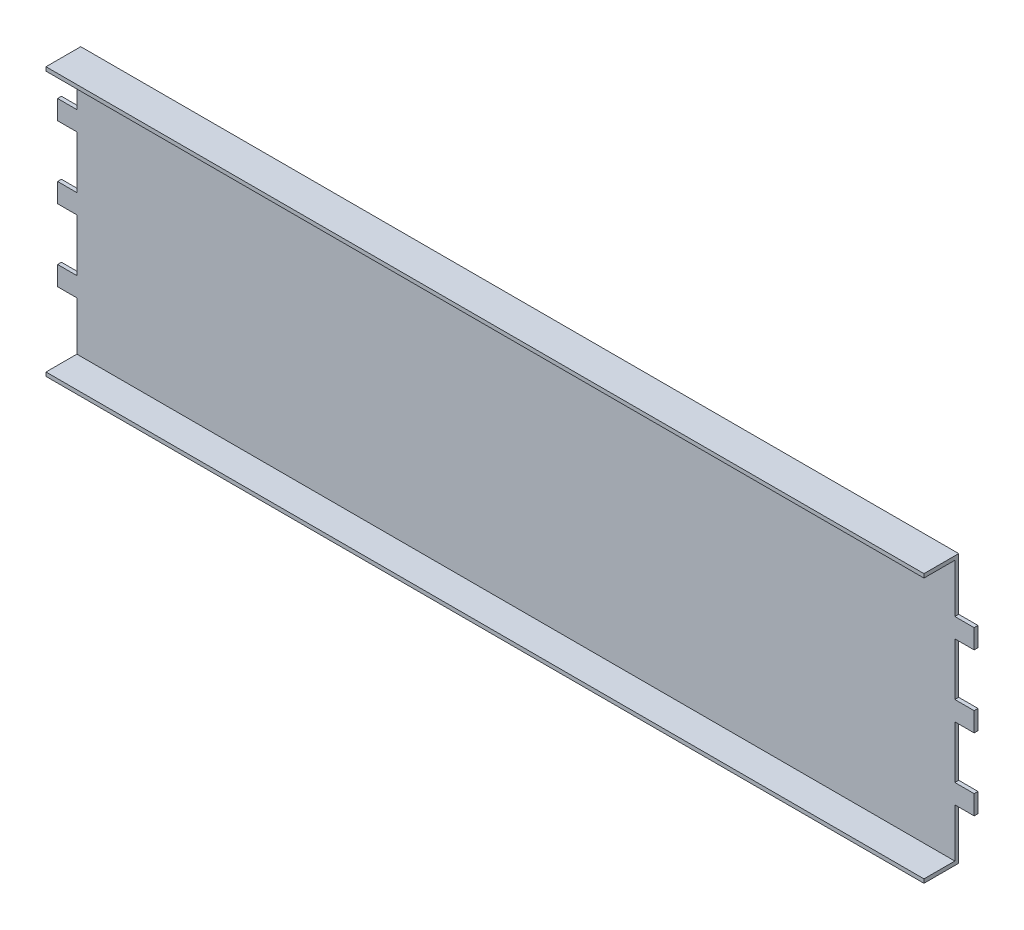
ISO-10303-21;
HEADER;
FILE_DESCRIPTION(('STEP AP214'),'2;1');
FILE_NAME('part.step','',(''),(''),'','','');
FILE_SCHEMA(('AUTOMOTIVE_DESIGN { 1 0 10303 214 1 1 1 1 }'));
ENDSEC;
DATA;
#1=APPLICATION_CONTEXT('core data for automotive mechanical design processes');
#2=APPLICATION_PROTOCOL_DEFINITION('international standard','automotive_design',2000,#1);
#3=PRODUCT_CONTEXT('',#1,'mechanical');
#4=PRODUCT('Part','Part','',(#3));
#5=PRODUCT_RELATED_PRODUCT_CATEGORY('part','',(#4));
#6=PRODUCT_DEFINITION_FORMATION('','',#4);
#7=PRODUCT_DEFINITION_CONTEXT('part definition',#1,'design');
#8=PRODUCT_DEFINITION('design','',#6,#7);
#9=PRODUCT_DEFINITION_SHAPE('','',#8);
#10=(LENGTH_UNIT() NAMED_UNIT(*) SI_UNIT(.MILLI.,.METRE.));
#11=(NAMED_UNIT(*) PLANE_ANGLE_UNIT() SI_UNIT($,.RADIAN.));
#12=(NAMED_UNIT(*) SI_UNIT($,.STERADIAN.) SOLID_ANGLE_UNIT());
#13=UNCERTAINTY_MEASURE_WITH_UNIT(LENGTH_MEASURE(1.E-05),#10,'distance_accuracy_value','');
#14=(GEOMETRIC_REPRESENTATION_CONTEXT(3) GLOBAL_UNCERTAINTY_ASSIGNED_CONTEXT((#13)) GLOBAL_UNIT_ASSIGNED_CONTEXT((#10,
#11,#12)) REPRESENTATION_CONTEXT('',''));
#15=CARTESIAN_POINT('',(0.,0.,0.));
#16=DIRECTION('',(0.,0.,1.));
#17=DIRECTION('',(1.,0.,0.));
#18=AXIS2_PLACEMENT_3D('',#15,#16,#17);
#19=CARTESIAN_POINT('',(90.5,81.5000000000001,0.));
#20=DIRECTION('',(1.,0.,0.));
#21=DIRECTION('',(0.,1.,0.));
#22=AXIS2_PLACEMENT_3D('',#19,#20,#21);
#23=PLANE('',#22);
#24=DIRECTION('',(0.,-1.,0.));
#25=VECTOR('',#24,1.);
#26=CARTESIAN_POINT('',(90.4999999999999,-1.02295014862437E-13,-8.00000000000001));
#27=LINE('',#26,#25);
#28=CARTESIAN_POINT('',(90.5000000000009,914.375000000002,-8.00000000000001));
#29=VERTEX_POINT('',#28);
#30=CARTESIAN_POINT('',(90.5000000000009,900.750000000002,-7.99999999999981));
#31=VERTEX_POINT('',#30);
#32=EDGE_CURVE('E344',#29,#31,#27,.T.);
#33=ORIENTED_EDGE('',*,*,#32,.F.);
#34=DIRECTION('',(0.,0.,-1.));
#35=VECTOR('',#34,1.);
#36=CARTESIAN_POINT('',(90.5000000000009,914.375000000002,-7.99999999999981));
#37=LINE('',#36,#35);
#38=CARTESIAN_POINT('',(90.5000000000009,914.375000000002,-9.00000000000001));
#39=VERTEX_POINT('',#38);
#40=EDGE_CURVE('E408',#29,#39,#37,.T.);
#41=ORIENTED_EDGE('',*,*,#40,.T.);
#42=DIRECTION('',(0.,-1.,0.));
#43=VECTOR('',#42,1.);
#44=CARTESIAN_POINT('',(90.4999999999999,-1.02295014862437E-13,-9.00000000000001));
#45=LINE('',#44,#43);
#46=CARTESIAN_POINT('',(90.5000000000009,900.750000000002,-9.00000000000001));
#47=VERTEX_POINT('',#46);
#48=EDGE_CURVE('E232',#39,#47,#45,.T.);
#49=ORIENTED_EDGE('',*,*,#48,.T.);
#50=DIRECTION('',(0.,0.,-1.));
#51=VECTOR('',#50,1.);
#52=CARTESIAN_POINT('',(90.5000000000009,900.750000000002,-7.99999999999981));
#53=LINE('',#52,#51);
#54=EDGE_CURVE('E379',#31,#47,#53,.T.);
#55=ORIENTED_EDGE('',*,*,#54,.F.);
#56=EDGE_LOOP('',(#33,#41,#49,#55));
#57=FACE_BOUND('',#56,.T.);
#58=ADVANCED_FACE('F15',(#57),#23,.F.);
#59=CARTESIAN_POINT('',(90.5000000000009,895.750000000002,-8.00000000000001));
#60=VERTEX_POINT('',#59);
#61=CARTESIAN_POINT('',(90.5000000000009,882.125000000002,-7.99999999999981));
#62=VERTEX_POINT('',#61);
#63=EDGE_CURVE('E844',#60,#62,#27,.T.);
#64=ORIENTED_EDGE('',*,*,#63,.F.);
#65=DIRECTION('',(0.,0.,-1.));
#66=VECTOR('',#65,1.);
#67=CARTESIAN_POINT('',(90.5000000000009,895.750000000002,-7.99999999999981));
#68=LINE('',#67,#66);
#69=CARTESIAN_POINT('',(90.5000000000009,895.750000000002,-9.00000000000001));
#70=VERTEX_POINT('',#69);
#71=EDGE_CURVE('E376',#60,#70,#68,.T.);
#72=ORIENTED_EDGE('',*,*,#71,.T.);
#73=CARTESIAN_POINT('',(90.5000000000009,882.125000000002,-9.00000000000001));
#74=VERTEX_POINT('',#73);
#75=EDGE_CURVE('E854',#70,#74,#45,.T.);
#76=ORIENTED_EDGE('',*,*,#75,.T.);
#77=DIRECTION('',(0.,0.,-1.));
#78=VECTOR('',#77,1.);
#79=CARTESIAN_POINT('',(90.5000000000009,882.125000000002,-7.99999999999981));
#80=LINE('',#79,#78);
#81=EDGE_CURVE('E318',#62,#74,#80,.T.);
#82=ORIENTED_EDGE('',*,*,#81,.F.);
#83=EDGE_LOOP('',(#64,#72,#76,#82));
#84=FACE_BOUND('',#83,.T.);
#85=ADVANCED_FACE('F564',(#84),#23,.F.);
#86=CARTESIAN_POINT('',(90.5000000000009,933.000000000002,-8.99999999999988));
#87=VERTEX_POINT('',#86);
#88=CARTESIAN_POINT('',(90.5000000000009,919.375000000002,-9.00000000000001));
#89=VERTEX_POINT('',#88);
#90=EDGE_CURVE('E229',#87,#89,#45,.T.);
#91=ORIENTED_EDGE('',*,*,#90,.T.);
#92=DIRECTION('',(0.,0.,-1.));
#93=VECTOR('',#92,1.);
#94=CARTESIAN_POINT('',(90.5000000000009,919.375000000002,-7.99999999999981));
#95=LINE('',#94,#93);
#96=CARTESIAN_POINT('',(90.5000000000009,919.375000000002,-7.99999999999981));
#97=VERTEX_POINT('',#96);
#98=EDGE_CURVE('E423',#97,#89,#95,.T.);
#99=ORIENTED_EDGE('',*,*,#98,.F.);
#100=CARTESIAN_POINT('',(90.5000000000009,932.000000000002,-7.99999999999981));
#101=VERTEX_POINT('',#100);
#102=EDGE_CURVE('E290',#101,#97,#27,.T.);
#103=ORIENTED_EDGE('',*,*,#102,.F.);
#104=DIRECTION('',(0.,0.,1.));
#105=VECTOR('',#104,1.);
#106=CARTESIAN_POINT('',(90.5000000000009,932.000000000002,-9.00000000000001));
#107=LINE('',#106,#105);
#108=CARTESIAN_POINT('',(90.5000000000009,932.000000000002,0.));
#109=VERTEX_POINT('',#108);
#110=EDGE_CURVE('E233',#101,#109,#107,.T.);
#111=ORIENTED_EDGE('',*,*,#110,.T.);
#112=DIRECTION('',(0.,-1.,0.));
#113=VECTOR('',#112,1.);
#114=CARTESIAN_POINT('',(90.5000000000009,863.500000000002,2.18575157973073E-13));
#115=LINE('',#114,#113);
#116=CARTESIAN_POINT('',(90.5000000000009,933.,0.));
#117=VERTEX_POINT('',#116);
#118=EDGE_CURVE('E185',#117,#109,#115,.T.);
#119=ORIENTED_EDGE('',*,*,#118,.F.);
#120=DIRECTION('',(0.,0.,1.));
#121=VECTOR('',#120,1.);
#122=CARTESIAN_POINT('',(90.5000000000009,933.000000000002,-9.00000000000001));
#123=LINE('',#122,#121);
#124=EDGE_CURVE('E193',#87,#117,#123,.T.);
#125=ORIENTED_EDGE('',*,*,#124,.F.);
#126=EDGE_LOOP('',(#91,#99,#103,#111,#119,#125));
#127=FACE_BOUND('',#126,.T.);
#128=ADVANCED_FACE('F509',(#127),#23,.F.);
#129=CARTESIAN_POINT('',(318.000000000002,863.500000000001,2.18575157973071E-13));
#130=DIRECTION('',(-1.,0.,0.));
#131=DIRECTION('',(0.,-1.,0.));
#132=AXIS2_PLACEMENT_3D('',#129,#130,#131);
#133=PLANE('',#132);
#134=DIRECTION('',(0.,1.,0.));
#135=VECTOR('',#134,1.);
#136=CARTESIAN_POINT('',(318.000000000003,4.17332834956603E-13,-8.00000000000001));
#137=LINE('',#136,#135);
#138=CARTESIAN_POINT('',(318.000000000001,882.125000000002,-8.00000000000001));
#139=VERTEX_POINT('',#138);
#140=CARTESIAN_POINT('',(318.000000000001,895.750000000002,-7.99999999999981));
#141=VERTEX_POINT('',#140);
#142=EDGE_CURVE('E194',#139,#141,#137,.T.);
#143=ORIENTED_EDGE('',*,*,#142,.F.);
#144=DIRECTION('',(0.,0.,-1.));
#145=VECTOR('',#144,1.);
#146=CARTESIAN_POINT('',(318.000000000001,882.125000000002,-7.99999999999981));
#147=LINE('',#146,#145);
#148=CARTESIAN_POINT('',(318.000000000001,882.125000000002,-9.00000000000001));
#149=VERTEX_POINT('',#148);
#150=EDGE_CURVE('E162',#139,#149,#147,.T.);
#151=ORIENTED_EDGE('',*,*,#150,.T.);
#152=DIRECTION('',(0.,1.,0.));
#153=VECTOR('',#152,1.);
#154=CARTESIAN_POINT('',(318.000000000003,4.17332834956603E-13,-9.00000000000001));
#155=LINE('',#154,#153);
#156=CARTESIAN_POINT('',(318.000000000001,895.750000000002,-9.00000000000001));
#157=VERTEX_POINT('',#156);
#158=EDGE_CURVE('E178',#149,#157,#155,.T.);
#159=ORIENTED_EDGE('',*,*,#158,.T.);
#160=DIRECTION('',(0.,0.,-1.));
#161=VECTOR('',#160,1.);
#162=CARTESIAN_POINT('',(318.000000000001,895.750000000002,-7.99999999999981));
#163=LINE('',#162,#161);
#164=EDGE_CURVE('E244',#141,#157,#163,.T.);
#165=ORIENTED_EDGE('',*,*,#164,.F.);
#166=EDGE_LOOP('',(#143,#151,#159,#165));
#167=FACE_BOUND('',#166,.T.);
#168=ADVANCED_FACE('F556',(#167),#133,.F.);
#169=DIRECTION('',(0.,1.,0.));
#170=VECTOR('',#169,1.);
#171=CARTESIAN_POINT('',(318.000000000003,4.17332834956603E-13,-8.00000000000001));
#172=LINE('',#171,#170);
#173=CARTESIAN_POINT('',(318.000000000001,900.750000000002,-8.00000000000001));
#174=VERTEX_POINT('',#173);
#175=CARTESIAN_POINT('',(318.000000000001,914.375000000002,-7.99999999999981));
#176=VERTEX_POINT('',#175);
#177=EDGE_CURVE('E268',#174,#176,#172,.T.);
#178=ORIENTED_EDGE('',*,*,#177,.F.);
#179=DIRECTION('',(0.,0.,-1.));
#180=VECTOR('',#179,1.);
#181=CARTESIAN_POINT('',(318.000000000001,900.750000000002,-7.99999999999981));
#182=LINE('',#181,#180);
#183=CARTESIAN_POINT('',(318.000000000001,900.750000000002,-9.00000000000001));
#184=VERTEX_POINT('',#183);
#185=EDGE_CURVE('E247',#174,#184,#182,.T.);
#186=ORIENTED_EDGE('',*,*,#185,.T.);
#187=DIRECTION('',(0.,1.,0.));
#188=VECTOR('',#187,1.);
#189=CARTESIAN_POINT('',(318.000000000003,4.17332834956603E-13,-9.00000000000001));
#190=LINE('',#189,#188);
#191=CARTESIAN_POINT('',(318.000000000001,914.375000000002,-9.00000000000001));
#192=VERTEX_POINT('',#191);
#193=EDGE_CURVE('E299',#184,#192,#190,.T.);
#194=ORIENTED_EDGE('',*,*,#193,.T.);
#195=DIRECTION('',(0.,0.,-1.));
#196=VECTOR('',#195,1.);
#197=CARTESIAN_POINT('',(318.000000000001,914.375000000002,-7.99999999999981));
#198=LINE('',#197,#196);
#199=EDGE_CURVE('E256',#176,#192,#198,.T.);
#200=ORIENTED_EDGE('',*,*,#199,.F.);
#201=EDGE_LOOP('',(#178,#186,#194,#200));
#202=FACE_BOUND('',#201,.T.);
#203=ADVANCED_FACE('F542',(#202),#133,.F.);
#204=DIRECTION('',(0.,1.,0.));
#205=VECTOR('',#204,1.);
#206=CARTESIAN_POINT('',(318.000000000003,4.17332834956603E-13,-9.00000000000001));
#207=LINE('',#206,#205);
#208=CARTESIAN_POINT('',(318.000000000001,863.500000000002,-8.99999999999985));
#209=VERTEX_POINT('',#208);
#210=CARTESIAN_POINT('',(318.000000000001,877.125000000002,-9.00000000000001));
#211=VERTEX_POINT('',#210);
#212=EDGE_CURVE('E175',#209,#211,#207,.T.);
#213=ORIENTED_EDGE('',*,*,#212,.T.);
#214=DIRECTION('',(0.,0.,-1.));
#215=VECTOR('',#214,1.);
#216=CARTESIAN_POINT('',(318.000000000001,877.125000000002,-7.99999999999981));
#217=LINE('',#216,#215);
#218=CARTESIAN_POINT('',(318.000000000001,877.125000000002,-7.99999999999981));
#219=VERTEX_POINT('',#218);
#220=EDGE_CURVE('E198',#219,#211,#217,.T.);
#221=ORIENTED_EDGE('',*,*,#220,.F.);
#222=DIRECTION('',(0.,1.,0.));
#223=VECTOR('',#222,1.);
#224=CARTESIAN_POINT('',(318.000000000003,4.17332834956603E-13,-8.00000000000001));
#225=LINE('',#224,#223);
#226=CARTESIAN_POINT('',(318.000000000002,864.5,-7.9999999999999));
#227=VERTEX_POINT('',#226);
#228=EDGE_CURVE('E191',#227,#219,#225,.T.);
#229=ORIENTED_EDGE('',*,*,#228,.F.);
#230=DIRECTION('',(0.,0.,-1.));
#231=VECTOR('',#230,1.);
#232=CARTESIAN_POINT('',(318.000000000002,864.5,-840.081223467358));
#233=LINE('',#232,#231);
#234=CARTESIAN_POINT('',(318.000000000002,864.5,0.));
#235=VERTEX_POINT('',#234);
#236=EDGE_CURVE('E187',#235,#227,#233,.T.);
#237=ORIENTED_EDGE('',*,*,#236,.F.);
#238=DIRECTION('',(0.,1.,0.));
#239=VECTOR('',#238,1.);
#240=CARTESIAN_POINT('',(318.000000000002,863.500000000001,2.18575157973071E-13));
#241=LINE('',#240,#239);
#242=CARTESIAN_POINT('',(318.000000000002,863.500000000001,2.18575157973071E-13));
#243=VERTEX_POINT('',#242);
#244=EDGE_CURVE('E183',#243,#235,#241,.T.);
#245=ORIENTED_EDGE('',*,*,#244,.F.);
#246=DIRECTION('',(0.,0.,1.));
#247=VECTOR('',#246,1.);
#248=CARTESIAN_POINT('',(318.000000000001,863.500000000002,-7.99999999999959));
#249=LINE('',#248,#247);
#250=EDGE_CURVE('E179',#209,#243,#249,.T.);
#251=ORIENTED_EDGE('',*,*,#250,.F.);
#252=EDGE_LOOP('',(#213,#221,#229,#237,#245,#251));
#253=FACE_BOUND('',#252,.T.);
#254=ADVANCED_FACE('F201',(#253),#133,.F.);
#255=CARTESIAN_POINT('',(90.5000000000009,877.125000000002,-7.99999999999981));
#256=VERTEX_POINT('',#255);
#257=CARTESIAN_POINT('',(90.5000000000009,864.500000000001,-7.9999999999999));
#258=VERTEX_POINT('',#257);
#259=EDGE_CURVE('E209',#256,#258,#27,.T.);
#260=ORIENTED_EDGE('',*,*,#259,.F.);
#261=DIRECTION('',(0.,0.,-1.));
#262=VECTOR('',#261,1.);
#263=CARTESIAN_POINT('',(90.5000000000009,877.125000000002,-7.99999999999981));
#264=LINE('',#263,#262);
#265=CARTESIAN_POINT('',(90.5000000000009,877.125000000002,-9.00000000000001));
#266=VERTEX_POINT('',#265);
#267=EDGE_CURVE('E315',#256,#266,#264,.T.);
#268=ORIENTED_EDGE('',*,*,#267,.T.);
#269=CARTESIAN_POINT('',(90.5000000000009,863.500000000002,-8.9999999999997));
#270=VERTEX_POINT('',#269);
#271=EDGE_CURVE('E177',#266,#270,#45,.T.);
#272=ORIENTED_EDGE('',*,*,#271,.T.);
#273=DIRECTION('',(0.,0.,1.));
#274=VECTOR('',#273,1.);
#275=CARTESIAN_POINT('',(90.5000000000014,863.500000000002,-7.99999999999962));
#276=LINE('',#275,#274);
#277=CARTESIAN_POINT('',(90.5,863.500000000002,0.));
#278=VERTEX_POINT('',#277);
#279=EDGE_CURVE('E238',#270,#278,#276,.T.);
#280=ORIENTED_EDGE('',*,*,#279,.T.);
#281=DIRECTION('',(0.,-1.,0.));
#282=VECTOR('',#281,1.);
#283=CARTESIAN_POINT('',(90.5000000000009,863.500000000002,2.18575157973073E-13));
#284=LINE('',#283,#282);
#285=CARTESIAN_POINT('',(90.5000000000009,864.5,0.));
#286=VERTEX_POINT('',#285);
#287=EDGE_CURVE('E186',#286,#278,#284,.T.);
#288=ORIENTED_EDGE('',*,*,#287,.F.);
#289=DIRECTION('',(0.,0.,1.));
#290=VECTOR('',#289,1.);
#291=CARTESIAN_POINT('',(90.5000000000009,864.500000000001,-840.081223467358));
#292=LINE('',#291,#290);
#293=EDGE_CURVE('E190',#258,#286,#292,.T.);
#294=ORIENTED_EDGE('',*,*,#293,.F.);
#295=EDGE_LOOP('',(#260,#268,#272,#280,#288,#294));
#296=FACE_BOUND('',#295,.T.);
#297=ADVANCED_FACE('F355',(#296),#23,.F.);
#298=DIRECTION('',(0.,1.,0.));
#299=VECTOR('',#298,1.);
#300=CARTESIAN_POINT('',(318.000000000003,4.17332834956603E-13,-8.00000000000001));
#301=LINE('',#300,#299);
#302=CARTESIAN_POINT('',(318.000000000001,919.375000000002,-7.99999999999981));
#303=VERTEX_POINT('',#302);
#304=CARTESIAN_POINT('',(318.000000000001,932.000000000002,-7.99999999999981));
#305=VERTEX_POINT('',#304);
#306=EDGE_CURVE('E279',#303,#305,#301,.T.);
#307=ORIENTED_EDGE('',*,*,#306,.F.);
#308=DIRECTION('',(0.,0.,-1.));
#309=VECTOR('',#308,1.);
#310=CARTESIAN_POINT('',(318.000000000001,919.375000000002,-7.99999999999981));
#311=LINE('',#310,#309);
#312=CARTESIAN_POINT('',(318.000000000001,919.375000000002,-9.00000000000001));
#313=VERTEX_POINT('',#312);
#314=EDGE_CURVE('E241',#303,#313,#311,.T.);
#315=ORIENTED_EDGE('',*,*,#314,.T.);
#316=DIRECTION('',(0.,1.,0.));
#317=VECTOR('',#316,1.);
#318=CARTESIAN_POINT('',(318.000000000003,4.17332834956603E-13,-9.00000000000001));
#319=LINE('',#318,#317);
#320=CARTESIAN_POINT('',(318.000000000001,933.000000000002,-8.99999999999988));
#321=VERTEX_POINT('',#320);
#322=EDGE_CURVE('E236',#313,#321,#319,.T.);
#323=ORIENTED_EDGE('',*,*,#322,.T.);
#324=DIRECTION('',(0.,0.,-1.));
#325=VECTOR('',#324,1.);
#326=CARTESIAN_POINT('',(318.000000000001,933.000000000002,-9.00000000000001));
#327=LINE('',#326,#325);
#328=CARTESIAN_POINT('',(318.000000000001,933.,0.));
#329=VERTEX_POINT('',#328);
#330=EDGE_CURVE('E295',#329,#321,#327,.T.);
#331=ORIENTED_EDGE('',*,*,#330,.F.);
#332=DIRECTION('',(0.,1.,0.));
#333=VECTOR('',#332,1.);
#334=CARTESIAN_POINT('',(318.000000000002,863.500000000001,2.18575157973071E-13));
#335=LINE('',#334,#333);
#336=CARTESIAN_POINT('',(318.000000000001,932.000000000002,0.));
#337=VERTEX_POINT('',#336);
#338=EDGE_CURVE('E293',#337,#329,#335,.T.);
#339=ORIENTED_EDGE('',*,*,#338,.F.);
#340=DIRECTION('',(0.,0.,-1.));
#341=VECTOR('',#340,1.);
#342=CARTESIAN_POINT('',(318.000000000001,932.000000000002,-9.00000000000001));
#343=LINE('',#342,#341);
#344=EDGE_CURVE('E237',#337,#305,#343,.T.);
#345=ORIENTED_EDGE('',*,*,#344,.T.);
#346=EDGE_LOOP('',(#307,#315,#323,#331,#339,#345));
#347=FACE_BOUND('',#346,.T.);
#348=ADVANCED_FACE('F518',(#347),#133,.F.);
#349=CARTESIAN_POINT('',(358.000000000002,863.500000000001,2.18575157973071E-13));
#350=DIRECTION('',(0.,0.,-1.));
#351=DIRECTION('',(0.,1.,0.));
#352=AXIS2_PLACEMENT_3D('',#349,#350,#351);
#353=PLANE('',#352);
#354=DIRECTION('',(1.,0.,0.));
#355=VECTOR('',#354,1.);
#356=CARTESIAN_POINT('',(0.,933.,0.));
#357=LINE('',#356,#355);
#358=EDGE_CURVE('E223',#329,#117,#357,.F.);
#359=ORIENTED_EDGE('',*,*,#358,.T.);
#360=ORIENTED_EDGE('',*,*,#118,.T.);
#361=DIRECTION('',(1.,0.,0.));
#362=VECTOR('',#361,1.);
#363=CARTESIAN_POINT('',(0.,932.000000000002,0.));
#364=LINE('',#363,#362);
#365=EDGE_CURVE('E220',#109,#337,#364,.T.);
#366=ORIENTED_EDGE('',*,*,#365,.T.);
#367=ORIENTED_EDGE('',*,*,#338,.T.);
#368=EDGE_LOOP('',(#359,#360,#366,#367));
#369=FACE_BOUND('',#368,.T.);
#370=ADVANCED_FACE('F513',(#369),#353,.F.);
#371=CARTESIAN_POINT('',(0.,0.,-9.00000000000001));
#372=DIRECTION('',(0.,0.,-1.));
#373=DIRECTION('',(0.,1.,0.));
#374=AXIS2_PLACEMENT_3D('',#371,#372,#373);
#375=PLANE('',#374);
#376=ORIENTED_EDGE('',*,*,#90,.F.);
#377=DIRECTION('',(1.,0.,0.));
#378=VECTOR('',#377,1.);
#379=CARTESIAN_POINT('',(437.500000000002,933.000000000002,-8.99999999999988));
#380=LINE('',#379,#378);
#381=EDGE_CURVE('E10',#87,#321,#380,.T.);
#382=ORIENTED_EDGE('',*,*,#381,.T.);
#383=ORIENTED_EDGE('',*,*,#322,.F.);
#384=DIRECTION('',(1.,0.,0.));
#385=VECTOR('',#384,1.);
#386=CARTESIAN_POINT('',(318.000000000001,919.375000000002,-9.00000000000001));
#387=LINE('',#386,#385);
#388=CARTESIAN_POINT('',(323.000000000001,919.375000000002,-9.00000000000001));
#389=VERTEX_POINT('',#388);
#390=EDGE_CURVE('E255',#313,#389,#387,.T.);
#391=ORIENTED_EDGE('',*,*,#390,.T.);
#392=DIRECTION('',(0.,-1.,0.));
#393=VECTOR('',#392,1.);
#394=CARTESIAN_POINT('',(323.000000000001,919.375000000002,-9.00000000000001));
#395=LINE('',#394,#393);
#396=CARTESIAN_POINT('',(323.000000000001,914.375000000002,-9.00000000000001));
#397=VERTEX_POINT('',#396);
#398=EDGE_CURVE('E302',#389,#397,#395,.T.);
#399=ORIENTED_EDGE('',*,*,#398,.T.);
#400=DIRECTION('',(-1.,0.,0.));
#401=VECTOR('',#400,1.);
#402=CARTESIAN_POINT('',(318.000000000001,914.375000000002,-9.00000000000001));
#403=LINE('',#402,#401);
#404=EDGE_CURVE('E288',#397,#192,#403,.T.);
#405=ORIENTED_EDGE('',*,*,#404,.T.);
#406=ORIENTED_EDGE('',*,*,#193,.F.);
#407=DIRECTION('',(1.,0.,0.));
#408=VECTOR('',#407,1.);
#409=CARTESIAN_POINT('',(318.000000000001,900.750000000002,-9.00000000000001));
#410=LINE('',#409,#408);
#411=CARTESIAN_POINT('',(323.000000000001,900.750000000002,-9.00000000000001));
#412=VERTEX_POINT('',#411);
#413=EDGE_CURVE('E243',#184,#412,#410,.T.);
#414=ORIENTED_EDGE('',*,*,#413,.T.);
#415=DIRECTION('',(0.,-1.,0.));
#416=VECTOR('',#415,1.);
#417=CARTESIAN_POINT('',(323.000000000001,900.750000000002,-9.00000000000001));
#418=LINE('',#417,#416);
#419=CARTESIAN_POINT('',(323.000000000001,895.750000000002,-9.00000000000001));
#420=VERTEX_POINT('',#419);
#421=EDGE_CURVE('E310',#412,#420,#418,.T.);
#422=ORIENTED_EDGE('',*,*,#421,.T.);
#423=DIRECTION('',(-1.,0.,0.));
#424=VECTOR('',#423,1.);
#425=CARTESIAN_POINT('',(318.000000000001,895.750000000002,-9.00000000000001));
#426=LINE('',#425,#424);
#427=EDGE_CURVE('E277',#420,#157,#426,.T.);
#428=ORIENTED_EDGE('',*,*,#427,.T.);
#429=ORIENTED_EDGE('',*,*,#158,.F.);
#430=DIRECTION('',(1.,0.,0.));
#431=VECTOR('',#430,1.);
#432=CARTESIAN_POINT('',(318.000000000001,882.125000000002,-9.00000000000001));
#433=LINE('',#432,#431);
#434=CARTESIAN_POINT('',(323.000000000001,882.125000000002,-9.00000000000001));
#435=VERTEX_POINT('',#434);
#436=EDGE_CURVE('E171',#149,#435,#433,.T.);
#437=ORIENTED_EDGE('',*,*,#436,.T.);
#438=DIRECTION('',(0.,-1.,0.));
#439=VECTOR('',#438,1.);
#440=CARTESIAN_POINT('',(323.000000000001,882.125000000002,-9.00000000000001));
#441=LINE('',#440,#439);
#442=CARTESIAN_POINT('',(323.000000000001,877.125000000002,-9.00000000000001));
#443=VERTEX_POINT('',#442);
#444=EDGE_CURVE('E147',#435,#443,#441,.T.);
#445=ORIENTED_EDGE('',*,*,#444,.T.);
#446=DIRECTION('',(-1.,0.,0.));
#447=VECTOR('',#446,1.);
#448=CARTESIAN_POINT('',(318.000000000001,877.125000000002,-9.00000000000001));
#449=LINE('',#448,#447);
#450=EDGE_CURVE('E164',#443,#211,#449,.T.);
#451=ORIENTED_EDGE('',*,*,#450,.T.);
#452=ORIENTED_EDGE('',*,*,#212,.F.);
#453=DIRECTION('',(-1.,0.,0.));
#454=VECTOR('',#453,1.);
#455=CARTESIAN_POINT('',(90.0000000000015,863.500000000002,-8.9999999999997));
#456=LINE('',#455,#454);
#457=EDGE_CURVE('E25',#209,#270,#456,.T.);
#458=ORIENTED_EDGE('',*,*,#457,.T.);
#459=ORIENTED_EDGE('',*,*,#271,.F.);
#460=DIRECTION('',(-1.,0.,0.));
#461=VECTOR('',#460,1.);
#462=CARTESIAN_POINT('',(90.5000000000009,877.125000000002,-9.00000000000001));
#463=LINE('',#462,#461);
#464=CARTESIAN_POINT('',(85.5000000000009,877.125000000002,-9.00000000000001));
#465=VERTEX_POINT('',#464);
#466=EDGE_CURVE('E368',#266,#465,#463,.T.);
#467=ORIENTED_EDGE('',*,*,#466,.T.);
#468=DIRECTION('',(0.,1.,0.));
#469=VECTOR('',#468,1.);
#470=CARTESIAN_POINT('',(85.5000000000009,877.125000000002,-9.00000000000001));
#471=LINE('',#470,#469);
#472=CARTESIAN_POINT('',(85.5000000000009,882.125000000002,-9.00000000000001));
#473=VERTEX_POINT('',#472);
#474=EDGE_CURVE('E375',#465,#473,#471,.T.);
#475=ORIENTED_EDGE('',*,*,#474,.T.);
#476=DIRECTION('',(1.,0.,0.));
#477=VECTOR('',#476,1.);
#478=CARTESIAN_POINT('',(90.5000000000009,882.125000000002,-9.00000000000001));
#479=LINE('',#478,#477);
#480=EDGE_CURVE('E328',#473,#74,#479,.T.);
#481=ORIENTED_EDGE('',*,*,#480,.T.);
#482=ORIENTED_EDGE('',*,*,#75,.F.);
#483=DIRECTION('',(-1.,0.,0.));
#484=VECTOR('',#483,1.);
#485=CARTESIAN_POINT('',(90.5000000000009,895.750000000002,-9.00000000000001));
#486=LINE('',#485,#484);
#487=CARTESIAN_POINT('',(85.5000000000009,895.750000000002,-9.00000000000001));
#488=VERTEX_POINT('',#487);
#489=EDGE_CURVE('E405',#70,#488,#486,.T.);
#490=ORIENTED_EDGE('',*,*,#489,.T.);
#491=DIRECTION('',(0.,1.,0.));
#492=VECTOR('',#491,1.);
#493=CARTESIAN_POINT('',(85.5000000000009,895.750000000002,-9.00000000000001));
#494=LINE('',#493,#492);
#495=CARTESIAN_POINT('',(85.5000000000009,900.750000000002,-9.00000000000001));
#496=VERTEX_POINT('',#495);
#497=EDGE_CURVE('E402',#488,#496,#494,.T.);
#498=ORIENTED_EDGE('',*,*,#497,.T.);
#499=DIRECTION('',(1.,0.,0.));
#500=VECTOR('',#499,1.);
#501=CARTESIAN_POINT('',(90.5000000000009,900.750000000002,-9.00000000000001));
#502=LINE('',#501,#500);
#503=EDGE_CURVE('E398',#496,#47,#502,.T.);
#504=ORIENTED_EDGE('',*,*,#503,.T.);
#505=ORIENTED_EDGE('',*,*,#48,.F.);
#506=DIRECTION('',(-1.,0.,0.));
#507=VECTOR('',#506,1.);
#508=CARTESIAN_POINT('',(90.5000000000009,914.375000000002,-9.00000000000001));
#509=LINE('',#508,#507);
#510=CARTESIAN_POINT('',(85.5000000000009,914.375000000002,-9.00000000000001));
#511=VERTEX_POINT('',#510);
#512=EDGE_CURVE('E434',#39,#511,#509,.T.);
#513=ORIENTED_EDGE('',*,*,#512,.T.);
#514=DIRECTION('',(0.,1.,0.));
#515=VECTOR('',#514,1.);
#516=CARTESIAN_POINT('',(85.5000000000009,914.375000000002,-9.00000000000001));
#517=LINE('',#516,#515);
#518=CARTESIAN_POINT('',(85.5000000000009,919.375000000002,-9.00000000000001));
#519=VERTEX_POINT('',#518);
#520=EDGE_CURVE('E431',#511,#519,#517,.T.);
#521=ORIENTED_EDGE('',*,*,#520,.T.);
#522=DIRECTION('',(1.,0.,0.));
#523=VECTOR('',#522,1.);
#524=CARTESIAN_POINT('',(90.5000000000009,919.375000000002,-9.00000000000001));
#525=LINE('',#524,#523);
#526=EDGE_CURVE('E428',#519,#89,#525,.T.);
#527=ORIENTED_EDGE('',*,*,#526,.T.);
#528=EDGE_LOOP('',(#376,#382,#383,#391,#399,#405,#406,#414,#422,#428,#429,#437,#445,#451,#452,
#458,#459,#467,#475,#481,#482,#490,#498,#504,#505,#513,#521,#527));
#529=FACE_BOUND('',#528,.T.);
#530=ADVANCED_FACE('F520',(#529),#375,.T.);
#531=CARTESIAN_POINT('',(437.500000000002,933.000000000002,-9.00000000000001));
#532=DIRECTION('',(0.,-1.,0.));
#533=DIRECTION('',(1.,0.,0.));
#534=AXIS2_PLACEMENT_3D('',#531,#532,#533);
#535=PLANE('',#534);
#536=ORIENTED_EDGE('',*,*,#381,.F.);
#537=ORIENTED_EDGE('',*,*,#124,.T.);
#538=ORIENTED_EDGE('',*,*,#358,.F.);
#539=ORIENTED_EDGE('',*,*,#330,.T.);
#540=EDGE_LOOP('',(#536,#537,#538,#539));
#541=FACE_BOUND('',#540,.T.);
#542=ADVANCED_FACE('F506',(#541),#535,.F.);
#543=DIRECTION('',(1.,0.,0.));
#544=VECTOR('',#543,1.);
#545=CARTESIAN_POINT('',(0.,864.5,0.));
#546=LINE('',#545,#544);
#547=EDGE_CURVE('E226',#235,#286,#546,.F.);
#548=ORIENTED_EDGE('',*,*,#547,.T.);
#549=ORIENTED_EDGE('',*,*,#287,.T.);
#550=DIRECTION('',(1.,0.,0.));
#551=VECTOR('',#550,1.);
#552=CARTESIAN_POINT('',(0.,863.500000000001,0.));
#553=LINE('',#552,#551);
#554=EDGE_CURVE('E189',#278,#243,#553,.T.);
#555=ORIENTED_EDGE('',*,*,#554,.T.);
#556=ORIENTED_EDGE('',*,*,#244,.T.);
#557=EDGE_LOOP('',(#548,#549,#555,#556));
#558=FACE_BOUND('',#557,.T.);
#559=ADVANCED_FACE('F350',(#558),#353,.F.);
#560=CARTESIAN_POINT('',(0.,0.,-8.00000000000001));
#561=DIRECTION('',(0.,0.,-1.));
#562=DIRECTION('',(0.,1.,0.));
#563=AXIS2_PLACEMENT_3D('',#560,#561,#562);
#564=PLANE('',#563);
#565=DIRECTION('',(1.,0.,0.));
#566=VECTOR('',#565,1.);
#567=CARTESIAN_POINT('',(437.500000000002,932.000000000002,-7.99999999999981));
#568=LINE('',#567,#566);
#569=EDGE_CURVE('E182',#101,#305,#568,.T.);
#570=ORIENTED_EDGE('',*,*,#569,.F.);
#571=ORIENTED_EDGE('',*,*,#102,.T.);
#572=DIRECTION('',(1.,0.,0.));
#573=VECTOR('',#572,1.);
#574=CARTESIAN_POINT('',(90.5000000000009,919.375000000002,-7.99999999999981));
#575=LINE('',#574,#573);
#576=CARTESIAN_POINT('',(85.5000000000009,919.375000000002,-7.99999999999981));
#577=VERTEX_POINT('',#576);
#578=EDGE_CURVE('E420',#577,#97,#575,.T.);
#579=ORIENTED_EDGE('',*,*,#578,.F.);
#580=DIRECTION('',(0.,1.,0.));
#581=VECTOR('',#580,1.);
#582=CARTESIAN_POINT('',(85.5000000000009,914.375000000002,-7.99999999999981));
#583=LINE('',#582,#581);
#584=CARTESIAN_POINT('',(85.5000000000009,914.375000000002,-7.99999999999981));
#585=VERTEX_POINT('',#584);
#586=EDGE_CURVE('E439',#585,#577,#583,.T.);
#587=ORIENTED_EDGE('',*,*,#586,.F.);
#588=DIRECTION('',(-1.,0.,0.));
#589=VECTOR('',#588,1.);
#590=CARTESIAN_POINT('',(90.5000000000009,914.375000000002,-7.99999999999981));
#591=LINE('',#590,#589);
#592=EDGE_CURVE('E34',#29,#585,#591,.T.);
#593=ORIENTED_EDGE('',*,*,#592,.F.);
#594=ORIENTED_EDGE('',*,*,#32,.T.);
#595=DIRECTION('',(1.,0.,0.));
#596=VECTOR('',#595,1.);
#597=CARTESIAN_POINT('',(90.5000000000009,900.750000000002,-7.99999999999981));
#598=LINE('',#597,#596);
#599=CARTESIAN_POINT('',(85.5000000000009,900.750000000002,-7.99999999999981));
#600=VERTEX_POINT('',#599);
#601=EDGE_CURVE('E393',#600,#31,#598,.T.);
#602=ORIENTED_EDGE('',*,*,#601,.F.);
#603=DIRECTION('',(0.,1.,0.));
#604=VECTOR('',#603,1.);
#605=CARTESIAN_POINT('',(85.5000000000009,895.750000000002,-7.99999999999981));
#606=LINE('',#605,#604);
#607=CARTESIAN_POINT('',(85.5000000000009,895.750000000002,-7.99999999999981));
#608=VERTEX_POINT('',#607);
#609=EDGE_CURVE('E411',#608,#600,#606,.T.);
#610=ORIENTED_EDGE('',*,*,#609,.F.);
#611=DIRECTION('',(-1.,0.,0.));
#612=VECTOR('',#611,1.);
#613=CARTESIAN_POINT('',(90.5000000000009,895.750000000002,-7.99999999999981));
#614=LINE('',#613,#612);
#615=EDGE_CURVE('E401',#60,#608,#614,.T.);
#616=ORIENTED_EDGE('',*,*,#615,.F.);
#617=ORIENTED_EDGE('',*,*,#63,.T.);
#618=DIRECTION('',(1.,0.,0.));
#619=VECTOR('',#618,1.);
#620=CARTESIAN_POINT('',(90.5000000000009,882.125000000002,-7.99999999999981));
#621=LINE('',#620,#619);
#622=CARTESIAN_POINT('',(85.5000000000009,882.125000000002,-7.99999999999981));
#623=VERTEX_POINT('',#622);
#624=EDGE_CURVE('E336',#623,#62,#621,.T.);
#625=ORIENTED_EDGE('',*,*,#624,.F.);
#626=DIRECTION('',(0.,1.,0.));
#627=VECTOR('',#626,1.);
#628=CARTESIAN_POINT('',(85.5000000000009,877.125000000002,-7.99999999999981));
#629=LINE('',#628,#627);
#630=CARTESIAN_POINT('',(85.5000000000009,877.125000000002,-7.99999999999981));
#631=VERTEX_POINT('',#630);
#632=EDGE_CURVE('E384',#631,#623,#629,.T.);
#633=ORIENTED_EDGE('',*,*,#632,.F.);
#634=DIRECTION('',(-1.,0.,0.));
#635=VECTOR('',#634,1.);
#636=CARTESIAN_POINT('',(90.5000000000009,877.125000000002,-7.99999999999981));
#637=LINE('',#636,#635);
#638=EDGE_CURVE('E387',#256,#631,#637,.T.);
#639=ORIENTED_EDGE('',*,*,#638,.F.);
#640=ORIENTED_EDGE('',*,*,#259,.T.);
#641=DIRECTION('',(1.,0.,0.));
#642=VECTOR('',#641,1.);
#643=CARTESIAN_POINT('',(358.000000000002,864.5,-7.9999999999999));
#644=LINE('',#643,#642);
#645=EDGE_CURVE('E181',#258,#227,#644,.T.);
#646=ORIENTED_EDGE('',*,*,#645,.T.);
#647=ORIENTED_EDGE('',*,*,#228,.T.);
#648=DIRECTION('',(-1.,0.,0.));
#649=VECTOR('',#648,1.);
#650=CARTESIAN_POINT('',(318.000000000001,877.125000000002,-7.99999999999981));
#651=LINE('',#650,#649);
#652=CARTESIAN_POINT('',(323.000000000001,877.125000000002,-7.99999999999981));
#653=VERTEX_POINT('',#652);
#654=EDGE_CURVE('E152',#653,#219,#651,.T.);
#655=ORIENTED_EDGE('',*,*,#654,.F.);
#656=DIRECTION('',(0.,-1.,0.));
#657=VECTOR('',#656,1.);
#658=CARTESIAN_POINT('',(323.000000000001,882.125000000002,-7.99999999999981));
#659=LINE('',#658,#657);
#660=CARTESIAN_POINT('',(323.000000000001,882.125000000002,-7.99999999999981));
#661=VERTEX_POINT('',#660);
#662=EDGE_CURVE('E145',#661,#653,#659,.T.);
#663=ORIENTED_EDGE('',*,*,#662,.F.);
#664=DIRECTION('',(1.,0.,0.));
#665=VECTOR('',#664,1.);
#666=CARTESIAN_POINT('',(318.000000000001,882.125000000002,-7.99999999999981));
#667=LINE('',#666,#665);
#668=EDGE_CURVE('E19',#139,#661,#667,.T.);
#669=ORIENTED_EDGE('',*,*,#668,.F.);
#670=ORIENTED_EDGE('',*,*,#142,.T.);
#671=DIRECTION('',(-1.,0.,0.));
#672=VECTOR('',#671,1.);
#673=CARTESIAN_POINT('',(318.000000000001,895.750000000002,-7.99999999999981));
#674=LINE('',#673,#672);
#675=CARTESIAN_POINT('',(323.000000000001,895.750000000002,-7.99999999999981));
#676=VERTEX_POINT('',#675);
#677=EDGE_CURVE('E252',#676,#141,#674,.T.);
#678=ORIENTED_EDGE('',*,*,#677,.F.);
#679=DIRECTION('',(0.,-1.,0.));
#680=VECTOR('',#679,1.);
#681=CARTESIAN_POINT('',(323.000000000001,900.750000000002,-7.99999999999981));
#682=LINE('',#681,#680);
#683=CARTESIAN_POINT('',(323.000000000001,900.750000000002,-7.99999999999981));
#684=VERTEX_POINT('',#683);
#685=EDGE_CURVE('E271',#684,#676,#682,.T.);
#686=ORIENTED_EDGE('',*,*,#685,.F.);
#687=DIRECTION('',(1.,0.,0.));
#688=VECTOR('',#687,1.);
#689=CARTESIAN_POINT('',(318.000000000001,900.750000000002,-7.99999999999981));
#690=LINE('',#689,#688);
#691=EDGE_CURVE('E274',#174,#684,#690,.T.);
#692=ORIENTED_EDGE('',*,*,#691,.F.);
#693=ORIENTED_EDGE('',*,*,#177,.T.);
#694=DIRECTION('',(-1.,0.,0.));
#695=VECTOR('',#694,1.);
#696=CARTESIAN_POINT('',(318.000000000001,914.375000000002,-7.99999999999981));
#697=LINE('',#696,#695);
#698=CARTESIAN_POINT('',(323.000000000001,914.375000000002,-7.99999999999981));
#699=VERTEX_POINT('',#698);
#700=EDGE_CURVE('E263',#699,#176,#697,.T.);
#701=ORIENTED_EDGE('',*,*,#700,.F.);
#702=DIRECTION('',(0.,-1.,0.));
#703=VECTOR('',#702,1.);
#704=CARTESIAN_POINT('',(323.000000000001,919.375000000002,-7.99999999999981));
#705=LINE('',#704,#703);
#706=CARTESIAN_POINT('',(323.000000000001,919.375000000002,-7.99999999999981));
#707=VERTEX_POINT('',#706);
#708=EDGE_CURVE('E282',#707,#699,#705,.T.);
#709=ORIENTED_EDGE('',*,*,#708,.F.);
#710=DIRECTION('',(1.,0.,0.));
#711=VECTOR('',#710,1.);
#712=CARTESIAN_POINT('',(318.000000000001,919.375000000002,-7.99999999999981));
#713=LINE('',#712,#711);
#714=EDGE_CURVE('E285',#303,#707,#713,.T.);
#715=ORIENTED_EDGE('',*,*,#714,.F.);
#716=ORIENTED_EDGE('',*,*,#306,.T.);
#717=EDGE_LOOP('',(#570,#571,#579,#587,#593,#594,#602,#610,#616,#617,#625,#633,#639,#640,#646,
#647,#655,#663,#669,#670,#678,#686,#692,#693,#701,#709,#715,#716));
#718=FACE_BOUND('',#717,.T.);
#719=ADVANCED_FACE('F157',(#718),#564,.F.);
#720=CARTESIAN_POINT('',(358.000000000002,864.5,-840.081223467358));
#721=DIRECTION('',(0.,-1.,0.));
#722=DIRECTION('',(1.,0.,0.));
#723=AXIS2_PLACEMENT_3D('',#720,#721,#722);
#724=PLANE('',#723);
#725=ORIENTED_EDGE('',*,*,#645,.F.);
#726=ORIENTED_EDGE('',*,*,#293,.T.);
#727=ORIENTED_EDGE('',*,*,#547,.F.);
#728=ORIENTED_EDGE('',*,*,#236,.T.);
#729=EDGE_LOOP('',(#725,#726,#727,#728));
#730=FACE_BOUND('',#729,.T.);
#731=ADVANCED_FACE('F360',(#730),#724,.F.);
#732=CARTESIAN_POINT('',(437.500000000002,932.000000000002,-9.00000000000001));
#733=DIRECTION('',(0.,-1.,0.));
#734=DIRECTION('',(1.,0.,0.));
#735=AXIS2_PLACEMENT_3D('',#732,#733,#734);
#736=PLANE('',#735);
#737=ORIENTED_EDGE('',*,*,#110,.F.);
#738=ORIENTED_EDGE('',*,*,#569,.T.);
#739=ORIENTED_EDGE('',*,*,#344,.F.);
#740=ORIENTED_EDGE('',*,*,#365,.F.);
#741=EDGE_LOOP('',(#737,#738,#739,#740));
#742=FACE_BOUND('',#741,.T.);
#743=ADVANCED_FACE('F527',(#742),#736,.T.);
#744=CARTESIAN_POINT('',(90.0000000000015,863.500000000002,-7.99999999999962));
#745=DIRECTION('',(0.,1.,0.));
#746=DIRECTION('',(-1.,0.,0.));
#747=AXIS2_PLACEMENT_3D('',#744,#745,#746);
#748=PLANE('',#747);
#749=ORIENTED_EDGE('',*,*,#554,.F.);
#750=ORIENTED_EDGE('',*,*,#279,.F.);
#751=ORIENTED_EDGE('',*,*,#457,.F.);
#752=ORIENTED_EDGE('',*,*,#250,.T.);
#753=EDGE_LOOP('',(#749,#750,#751,#752));
#754=FACE_BOUND('',#753,.T.);
#755=ADVANCED_FACE('F358',(#754),#748,.F.);
#756=CARTESIAN_POINT('',(318.000000000001,919.375000000002,-7.99999999999981));
#757=DIRECTION('',(0.,1.,0.));
#758=DIRECTION('',(0.,0.,1.));
#759=AXIS2_PLACEMENT_3D('',#756,#757,#758);
#760=PLANE('',#759);
#761=ORIENTED_EDGE('',*,*,#390,.F.);
#762=ORIENTED_EDGE('',*,*,#314,.F.);
#763=ORIENTED_EDGE('',*,*,#714,.T.);
#764=DIRECTION('',(0.,0.,-1.));
#765=VECTOR('',#764,1.);
#766=CARTESIAN_POINT('',(323.000000000001,919.375000000002,-7.99999999999981));
#767=LINE('',#766,#765);
#768=EDGE_CURVE('E261',#707,#389,#767,.T.);
#769=ORIENTED_EDGE('',*,*,#768,.T.);
#770=EDGE_LOOP('',(#761,#762,#763,#769));
#771=FACE_BOUND('',#770,.T.);
#772=ADVANCED_FACE('F529',(#771),#760,.T.);
#773=CARTESIAN_POINT('',(318.000000000001,914.375000000002,-7.99999999999981));
#774=DIRECTION('',(0.,-1.,0.));
#775=DIRECTION('',(0.,0.,-1.));
#776=AXIS2_PLACEMENT_3D('',#773,#774,#775);
#777=PLANE('',#776);
#778=ORIENTED_EDGE('',*,*,#404,.F.);
#779=DIRECTION('',(0.,0.,-1.));
#780=VECTOR('',#779,1.);
#781=CARTESIAN_POINT('',(323.000000000001,914.375000000002,-7.99999999999981));
#782=LINE('',#781,#780);
#783=EDGE_CURVE('E259',#699,#397,#782,.T.);
#784=ORIENTED_EDGE('',*,*,#783,.F.);
#785=ORIENTED_EDGE('',*,*,#700,.T.);
#786=ORIENTED_EDGE('',*,*,#199,.T.);
#787=EDGE_LOOP('',(#778,#784,#785,#786));
#788=FACE_BOUND('',#787,.T.);
#789=ADVANCED_FACE('F538',(#788),#777,.T.);
#790=CARTESIAN_POINT('',(323.000000000001,919.375000000002,-7.99999999999981));
#791=DIRECTION('',(1.,0.,0.));
#792=DIRECTION('',(0.,0.,-1.));
#793=AXIS2_PLACEMENT_3D('',#790,#791,#792);
#794=PLANE('',#793);
#795=ORIENTED_EDGE('',*,*,#398,.F.);
#796=ORIENTED_EDGE('',*,*,#768,.F.);
#797=ORIENTED_EDGE('',*,*,#708,.T.);
#798=ORIENTED_EDGE('',*,*,#783,.T.);
#799=EDGE_LOOP('',(#795,#796,#797,#798));
#800=FACE_BOUND('',#799,.T.);
#801=ADVANCED_FACE('F534',(#800),#794,.T.);
#802=CARTESIAN_POINT('',(318.000000000001,900.750000000002,-7.99999999999981));
#803=DIRECTION('',(0.,1.,0.));
#804=DIRECTION('',(0.,0.,1.));
#805=AXIS2_PLACEMENT_3D('',#802,#803,#804);
#806=PLANE('',#805);
#807=ORIENTED_EDGE('',*,*,#413,.F.);
#808=ORIENTED_EDGE('',*,*,#185,.F.);
#809=ORIENTED_EDGE('',*,*,#691,.T.);
#810=DIRECTION('',(0.,0.,-1.));
#811=VECTOR('',#810,1.);
#812=CARTESIAN_POINT('',(323.000000000001,900.750000000002,-7.99999999999981));
#813=LINE('',#812,#811);
#814=EDGE_CURVE('E250',#684,#412,#813,.T.);
#815=ORIENTED_EDGE('',*,*,#814,.T.);
#816=EDGE_LOOP('',(#807,#808,#809,#815));
#817=FACE_BOUND('',#816,.T.);
#818=ADVANCED_FACE('F545',(#817),#806,.T.);
#819=CARTESIAN_POINT('',(318.000000000001,895.750000000002,-7.99999999999981));
#820=DIRECTION('',(0.,-1.,0.));
#821=DIRECTION('',(0.,0.,-1.));
#822=AXIS2_PLACEMENT_3D('',#819,#820,#821);
#823=PLANE('',#822);
#824=ORIENTED_EDGE('',*,*,#427,.F.);
#825=DIRECTION('',(0.,0.,-1.));
#826=VECTOR('',#825,1.);
#827=CARTESIAN_POINT('',(323.000000000001,895.750000000002,-7.99999999999981));
#828=LINE('',#827,#826);
#829=EDGE_CURVE('E248',#676,#420,#828,.T.);
#830=ORIENTED_EDGE('',*,*,#829,.F.);
#831=ORIENTED_EDGE('',*,*,#677,.T.);
#832=ORIENTED_EDGE('',*,*,#164,.T.);
#833=EDGE_LOOP('',(#824,#830,#831,#832));
#834=FACE_BOUND('',#833,.T.);
#835=ADVANCED_FACE('F553',(#834),#823,.T.);
#836=CARTESIAN_POINT('',(323.000000000001,900.750000000002,-7.99999999999981));
#837=DIRECTION('',(1.,0.,0.));
#838=DIRECTION('',(0.,0.,-1.));
#839=AXIS2_PLACEMENT_3D('',#836,#837,#838);
#840=PLANE('',#839);
#841=ORIENTED_EDGE('',*,*,#421,.F.);
#842=ORIENTED_EDGE('',*,*,#814,.F.);
#843=ORIENTED_EDGE('',*,*,#685,.T.);
#844=ORIENTED_EDGE('',*,*,#829,.T.);
#845=EDGE_LOOP('',(#841,#842,#843,#844));
#846=FACE_BOUND('',#845,.T.);
#847=ADVANCED_FACE('F549',(#846),#840,.T.);
#848=CARTESIAN_POINT('',(318.000000000001,882.125000000002,-7.99999999999981));
#849=DIRECTION('',(0.,1.,0.));
#850=DIRECTION('',(0.,0.,1.));
#851=AXIS2_PLACEMENT_3D('',#848,#849,#850);
#852=PLANE('',#851);
#853=ORIENTED_EDGE('',*,*,#436,.F.);
#854=ORIENTED_EDGE('',*,*,#150,.F.);
#855=ORIENTED_EDGE('',*,*,#668,.T.);
#856=DIRECTION('',(0.,0.,-1.));
#857=VECTOR('',#856,1.);
#858=CARTESIAN_POINT('',(323.000000000001,882.125000000002,-7.99999999999981));
#859=LINE('',#858,#857);
#860=EDGE_CURVE('E143',#661,#435,#859,.T.);
#861=ORIENTED_EDGE('',*,*,#860,.T.);
#862=EDGE_LOOP('',(#853,#854,#855,#861));
#863=FACE_BOUND('',#862,.T.);
#864=ADVANCED_FACE('F160',(#863),#852,.T.);
#865=CARTESIAN_POINT('',(318.000000000001,877.125000000002,-7.99999999999981));
#866=DIRECTION('',(0.,-1.,0.));
#867=DIRECTION('',(0.,0.,-1.));
#868=AXIS2_PLACEMENT_3D('',#865,#866,#867);
#869=PLANE('',#868);
#870=ORIENTED_EDGE('',*,*,#450,.F.);
#871=DIRECTION('',(0.,0.,-1.));
#872=VECTOR('',#871,1.);
#873=CARTESIAN_POINT('',(323.000000000001,877.125000000002,-7.99999999999981));
#874=LINE('',#873,#872);
#875=EDGE_CURVE('E151',#653,#443,#874,.T.);
#876=ORIENTED_EDGE('',*,*,#875,.F.);
#877=ORIENTED_EDGE('',*,*,#654,.T.);
#878=ORIENTED_EDGE('',*,*,#220,.T.);
#879=EDGE_LOOP('',(#870,#876,#877,#878));
#880=FACE_BOUND('',#879,.T.);
#881=ADVANCED_FACE('F197',(#880),#869,.T.);
#882=CARTESIAN_POINT('',(323.000000000001,882.125000000002,-7.99999999999981));
#883=DIRECTION('',(1.,0.,0.));
#884=DIRECTION('',(0.,0.,-1.));
#885=AXIS2_PLACEMENT_3D('',#882,#883,#884);
#886=PLANE('',#885);
#887=ORIENTED_EDGE('',*,*,#444,.F.);
#888=ORIENTED_EDGE('',*,*,#860,.F.);
#889=ORIENTED_EDGE('',*,*,#662,.T.);
#890=ORIENTED_EDGE('',*,*,#875,.T.);
#891=EDGE_LOOP('',(#887,#888,#889,#890));
#892=FACE_BOUND('',#891,.T.);
#893=ADVANCED_FACE('F17',(#892),#886,.T.);
#894=CARTESIAN_POINT('',(90.5000000000009,877.125000000002,-7.99999999999981));
#895=DIRECTION('',(0.,-1.,0.));
#896=DIRECTION('',(0.,0.,-1.));
#897=AXIS2_PLACEMENT_3D('',#894,#895,#896);
#898=PLANE('',#897);
#899=ORIENTED_EDGE('',*,*,#466,.F.);
#900=ORIENTED_EDGE('',*,*,#267,.F.);
#901=ORIENTED_EDGE('',*,*,#638,.T.);
#902=DIRECTION('',(0.,0.,-1.));
#903=VECTOR('',#902,1.);
#904=CARTESIAN_POINT('',(85.5000000000009,877.125000000002,-7.99999999999981));
#905=LINE('',#904,#903);
#906=EDGE_CURVE('E333',#631,#465,#905,.T.);
#907=ORIENTED_EDGE('',*,*,#906,.T.);
#908=EDGE_LOOP('',(#899,#900,#901,#907));
#909=FACE_BOUND('',#908,.T.);
#910=ADVANCED_FACE('F369',(#909),#898,.T.);
#911=CARTESIAN_POINT('',(90.5000000000009,882.125000000002,-7.99999999999981));
#912=DIRECTION('',(0.,1.,0.));
#913=DIRECTION('',(0.,0.,1.));
#914=AXIS2_PLACEMENT_3D('',#911,#912,#913);
#915=PLANE('',#914);
#916=ORIENTED_EDGE('',*,*,#480,.F.);
#917=DIRECTION('',(0.,0.,-1.));
#918=VECTOR('',#917,1.);
#919=CARTESIAN_POINT('',(85.5000000000009,882.125000000002,-7.99999999999981));
#920=LINE('',#919,#918);
#921=EDGE_CURVE('E325',#623,#473,#920,.T.);
#922=ORIENTED_EDGE('',*,*,#921,.F.);
#923=ORIENTED_EDGE('',*,*,#624,.T.);
#924=ORIENTED_EDGE('',*,*,#81,.T.);
#925=EDGE_LOOP('',(#916,#922,#923,#924));
#926=FACE_BOUND('',#925,.T.);
#927=ADVANCED_FACE('F763',(#926),#915,.T.);
#928=CARTESIAN_POINT('',(85.5000000000009,877.125000000002,-7.99999999999981));
#929=DIRECTION('',(-1.,0.,0.));
#930=DIRECTION('',(0.,0.,1.));
#931=AXIS2_PLACEMENT_3D('',#928,#929,#930);
#932=PLANE('',#931);
#933=ORIENTED_EDGE('',*,*,#474,.F.);
#934=ORIENTED_EDGE('',*,*,#906,.F.);
#935=ORIENTED_EDGE('',*,*,#632,.T.);
#936=ORIENTED_EDGE('',*,*,#921,.T.);
#937=EDGE_LOOP('',(#933,#934,#935,#936));
#938=FACE_BOUND('',#937,.T.);
#939=ADVANCED_FACE('F772',(#938),#932,.T.);
#940=CARTESIAN_POINT('',(90.5000000000009,895.750000000002,-7.99999999999981));
#941=DIRECTION('',(0.,-1.,0.));
#942=DIRECTION('',(0.,0.,-1.));
#943=AXIS2_PLACEMENT_3D('',#940,#941,#942);
#944=PLANE('',#943);
#945=ORIENTED_EDGE('',*,*,#489,.F.);
#946=ORIENTED_EDGE('',*,*,#71,.F.);
#947=ORIENTED_EDGE('',*,*,#615,.T.);
#948=DIRECTION('',(0.,0.,-1.));
#949=VECTOR('',#948,1.);
#950=CARTESIAN_POINT('',(85.5000000000009,895.750000000002,-7.99999999999981));
#951=LINE('',#950,#949);
#952=EDGE_CURVE('E389',#608,#488,#951,.T.);
#953=ORIENTED_EDGE('',*,*,#952,.T.);
#954=EDGE_LOOP('',(#945,#946,#947,#953));
#955=FACE_BOUND('',#954,.T.);
#956=ADVANCED_FACE('F782',(#955),#944,.T.);
#957=CARTESIAN_POINT('',(90.5000000000009,900.750000000002,-7.99999999999981));
#958=DIRECTION('',(0.,1.,0.));
#959=DIRECTION('',(0.,0.,1.));
#960=AXIS2_PLACEMENT_3D('',#957,#958,#959);
#961=PLANE('',#960);
#962=ORIENTED_EDGE('',*,*,#503,.F.);
#963=DIRECTION('',(0.,0.,-1.));
#964=VECTOR('',#963,1.);
#965=CARTESIAN_POINT('',(85.5000000000009,900.750000000002,-7.99999999999981));
#966=LINE('',#965,#964);
#967=EDGE_CURVE('E392',#600,#496,#966,.T.);
#968=ORIENTED_EDGE('',*,*,#967,.F.);
#969=ORIENTED_EDGE('',*,*,#601,.T.);
#970=ORIENTED_EDGE('',*,*,#54,.T.);
#971=EDGE_LOOP('',(#962,#968,#969,#970));
#972=FACE_BOUND('',#971,.T.);
#973=ADVANCED_FACE('F792',(#972),#961,.T.);
#974=CARTESIAN_POINT('',(85.5000000000009,895.750000000002,-7.99999999999981));
#975=DIRECTION('',(-1.,0.,0.));
#976=DIRECTION('',(0.,0.,1.));
#977=AXIS2_PLACEMENT_3D('',#974,#975,#976);
#978=PLANE('',#977);
#979=ORIENTED_EDGE('',*,*,#497,.F.);
#980=ORIENTED_EDGE('',*,*,#952,.F.);
#981=ORIENTED_EDGE('',*,*,#609,.T.);
#982=ORIENTED_EDGE('',*,*,#967,.T.);
#983=EDGE_LOOP('',(#979,#980,#981,#982));
#984=FACE_BOUND('',#983,.T.);
#985=ADVANCED_FACE('F802',(#984),#978,.T.);
#986=CARTESIAN_POINT('',(90.5000000000009,914.375000000002,-7.99999999999981));
#987=DIRECTION('',(0.,-1.,0.));
#988=DIRECTION('',(0.,0.,-1.));
#989=AXIS2_PLACEMENT_3D('',#986,#987,#988);
#990=PLANE('',#989);
#991=ORIENTED_EDGE('',*,*,#512,.F.);
#992=ORIENTED_EDGE('',*,*,#40,.F.);
#993=ORIENTED_EDGE('',*,*,#592,.T.);
#994=DIRECTION('',(0.,0.,-1.));
#995=VECTOR('',#994,1.);
#996=CARTESIAN_POINT('',(85.5000000000009,914.375000000002,-7.99999999999981));
#997=LINE('',#996,#995);
#998=EDGE_CURVE('E416',#585,#511,#997,.T.);
#999=ORIENTED_EDGE('',*,*,#998,.T.);
#1000=EDGE_LOOP('',(#991,#992,#993,#999));
#1001=FACE_BOUND('',#1000,.T.);
#1002=ADVANCED_FACE('F445',(#1001),#990,.T.);
#1003=CARTESIAN_POINT('',(90.5000000000009,919.375000000002,-7.99999999999981));
#1004=DIRECTION('',(0.,1.,0.));
#1005=DIRECTION('',(0.,0.,1.));
#1006=AXIS2_PLACEMENT_3D('',#1003,#1004,#1005);
#1007=PLANE('',#1006);
#1008=ORIENTED_EDGE('',*,*,#526,.F.);
#1009=DIRECTION('',(0.,0.,-1.));
#1010=VECTOR('',#1009,1.);
#1011=CARTESIAN_POINT('',(85.5000000000009,919.375000000002,-7.99999999999981));
#1012=LINE('',#1011,#1010);
#1013=EDGE_CURVE('E419',#577,#519,#1012,.T.);
#1014=ORIENTED_EDGE('',*,*,#1013,.F.);
#1015=ORIENTED_EDGE('',*,*,#578,.T.);
#1016=ORIENTED_EDGE('',*,*,#98,.T.);
#1017=EDGE_LOOP('',(#1008,#1014,#1015,#1016));
#1018=FACE_BOUND('',#1017,.T.);
#1019=ADVANCED_FACE('F821',(#1018),#1007,.T.);
#1020=CARTESIAN_POINT('',(85.5000000000009,914.375000000002,-7.99999999999981));
#1021=DIRECTION('',(-1.,0.,0.));
#1022=DIRECTION('',(0.,0.,1.));
#1023=AXIS2_PLACEMENT_3D('',#1020,#1021,#1022);
#1024=PLANE('',#1023);
#1025=ORIENTED_EDGE('',*,*,#520,.F.);
#1026=ORIENTED_EDGE('',*,*,#998,.F.);
#1027=ORIENTED_EDGE('',*,*,#586,.T.);
#1028=ORIENTED_EDGE('',*,*,#1013,.T.);
#1029=EDGE_LOOP('',(#1025,#1026,#1027,#1028));
#1030=FACE_BOUND('',#1029,.T.);
#1031=ADVANCED_FACE('F830',(#1030),#1024,.T.);
#1032=CLOSED_SHELL('',(#58,#85,#128,#168,#203,#254,#297,#348,#370,#530,#542,#559,#719,#731,#743,
#755,#772,#789,#801,#818,#835,#847,#864,#881,#893,#910,#927,#939,#956,#973,#985,#1002,#1019,#1031));
#1033=MANIFOLD_SOLID_BREP('B1',#1032);
#1034=ADVANCED_BREP_SHAPE_REPRESENTATION('',(#18,#1033),#14);
#1035=SHAPE_DEFINITION_REPRESENTATION(#9,#1034);
ENDSEC;
END-ISO-10303-21;
